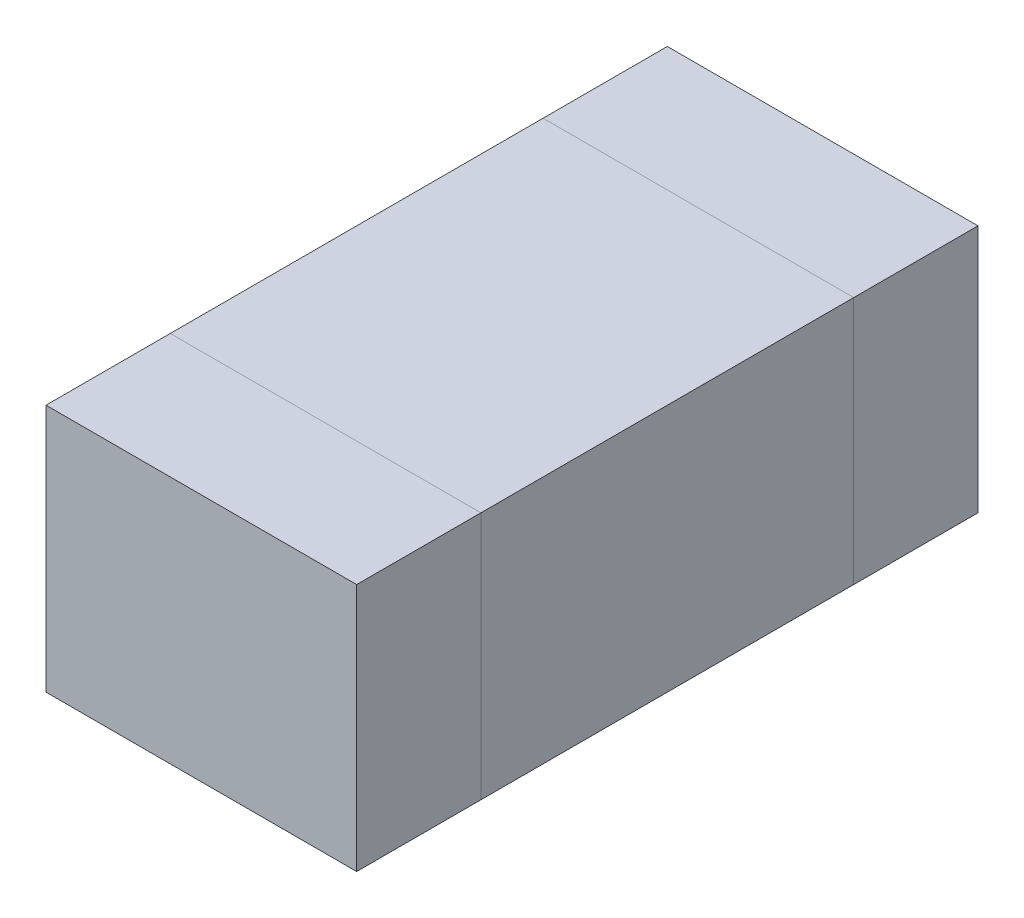
ISO-10303-21;
HEADER;
FILE_DESCRIPTION(('STEP AP214'),'2;1');
FILE_NAME('part.step','',(''),(''),'','','');
FILE_SCHEMA(('AUTOMOTIVE_DESIGN { 1 0 10303 214 1 1 1 1 }'));
ENDSEC;
DATA;
#1=APPLICATION_CONTEXT('core data for automotive mechanical design processes');
#2=APPLICATION_PROTOCOL_DEFINITION('international standard','automotive_design',2000,#1);
#3=PRODUCT_CONTEXT('',#1,'mechanical');
#4=PRODUCT('Part','Part','',(#3));
#5=PRODUCT_RELATED_PRODUCT_CATEGORY('part','',(#4));
#6=PRODUCT_DEFINITION_FORMATION('','',#4);
#7=PRODUCT_DEFINITION_CONTEXT('part definition',#1,'design');
#8=PRODUCT_DEFINITION('design','',#6,#7);
#9=PRODUCT_DEFINITION_SHAPE('','',#8);
#10=(LENGTH_UNIT() NAMED_UNIT(*) SI_UNIT(.MILLI.,.METRE.));
#11=(NAMED_UNIT(*) PLANE_ANGLE_UNIT() SI_UNIT($,.RADIAN.));
#12=(NAMED_UNIT(*) SI_UNIT($,.STERADIAN.) SOLID_ANGLE_UNIT());
#13=UNCERTAINTY_MEASURE_WITH_UNIT(LENGTH_MEASURE(1.E-05),#10,'distance_accuracy_value','');
#14=(GEOMETRIC_REPRESENTATION_CONTEXT(3) GLOBAL_UNCERTAINTY_ASSIGNED_CONTEXT((#13)) GLOBAL_UNIT_ASSIGNED_CONTEXT((#10,
#11,#12)) REPRESENTATION_CONTEXT('',''));
#15=CARTESIAN_POINT('',(0.,0.,0.));
#16=DIRECTION('',(0.,0.,1.));
#17=DIRECTION('',(1.,0.,0.));
#18=AXIS2_PLACEMENT_3D('',#15,#16,#17);
#19=CARTESIAN_POINT('',(0.,0.,0.));
#20=DIRECTION('',(0.,1.,0.));
#21=DIRECTION('',(1.,0.,0.));
#22=AXIS2_PLACEMENT_3D('',#19,#20,#21);
#23=PLANE('',#22);
#24=DIRECTION('',(0.,0.,-1.));
#25=VECTOR('',#24,1.);
#26=CARTESIAN_POINT('',(0.25,0.,-0.3));
#27=LINE('',#26,#25);
#28=CARTESIAN_POINT('',(0.25,0.,0.3));
#29=VERTEX_POINT('',#28);
#30=CARTESIAN_POINT('',(0.25,0.,-0.3));
#31=VERTEX_POINT('',#30);
#32=EDGE_CURVE('P0_E91',#29,#31,#27,.T.);
#33=ORIENTED_EDGE('',*,*,#32,.F.);
#34=DIRECTION('',(1.,0.,0.));
#35=VECTOR('',#34,1.);
#36=CARTESIAN_POINT('',(-0.25,0.,0.3));
#37=LINE('',#36,#35);
#38=CARTESIAN_POINT('',(-0.25,0.,0.3));
#39=VERTEX_POINT('',#38);
#40=EDGE_CURVE('P0_E25',#39,#29,#37,.T.);
#41=ORIENTED_EDGE('',*,*,#40,.F.);
#42=DIRECTION('',(0.,0.,1.));
#43=VECTOR('',#42,1.);
#44=CARTESIAN_POINT('',(-0.25,0.,-0.3));
#45=LINE('',#44,#43);
#46=CARTESIAN_POINT('',(-0.25,0.,-0.3));
#47=VERTEX_POINT('',#46);
#48=EDGE_CURVE('P0_E100',#47,#39,#45,.T.);
#49=ORIENTED_EDGE('',*,*,#48,.F.);
#50=DIRECTION('',(-1.,0.,0.));
#51=VECTOR('',#50,1.);
#52=CARTESIAN_POINT('',(-0.25,0.,-0.3));
#53=LINE('',#52,#51);
#54=EDGE_CURVE('P0_E80',#31,#47,#53,.T.);
#55=ORIENTED_EDGE('',*,*,#54,.F.);
#56=EDGE_LOOP('',(#33,#41,#49,#55));
#57=FACE_BOUND('',#56,.T.);
#58=ADVANCED_FACE('P0_F16',(#57),#23,.F.);
#59=CARTESIAN_POINT('',(0.,0.4,0.));
#60=DIRECTION('',(0.,1.,0.));
#61=DIRECTION('',(1.,0.,0.));
#62=AXIS2_PLACEMENT_3D('',#59,#60,#61);
#63=PLANE('',#62);
#64=DIRECTION('',(0.,0.,-1.));
#65=VECTOR('',#64,1.);
#66=CARTESIAN_POINT('',(0.25,0.4,-0.3));
#67=LINE('',#66,#65);
#68=CARTESIAN_POINT('',(0.25,0.4,0.3));
#69=VERTEX_POINT('',#68);
#70=CARTESIAN_POINT('',(0.25,0.4,-0.3));
#71=VERTEX_POINT('',#70);
#72=EDGE_CURVE('P0_E71',#69,#71,#67,.T.);
#73=ORIENTED_EDGE('',*,*,#72,.T.);
#74=DIRECTION('',(-1.,0.,0.));
#75=VECTOR('',#74,1.);
#76=CARTESIAN_POINT('',(-0.25,0.4,-0.3));
#77=LINE('',#76,#75);
#78=CARTESIAN_POINT('',(-0.25,0.4,-0.3));
#79=VERTEX_POINT('',#78);
#80=EDGE_CURVE('P0_E105',#71,#79,#77,.T.);
#81=ORIENTED_EDGE('',*,*,#80,.T.);
#82=DIRECTION('',(0.,0.,1.));
#83=VECTOR('',#82,1.);
#84=CARTESIAN_POINT('',(-0.25,0.4,-0.3));
#85=LINE('',#84,#83);
#86=CARTESIAN_POINT('',(-0.25,0.4,0.3));
#87=VERTEX_POINT('',#86);
#88=EDGE_CURVE('P0_E73',#79,#87,#85,.T.);
#89=ORIENTED_EDGE('',*,*,#88,.T.);
#90=DIRECTION('',(1.,0.,0.));
#91=VECTOR('',#90,1.);
#92=CARTESIAN_POINT('',(-0.25,0.4,0.3));
#93=LINE('',#92,#91);
#94=EDGE_CURVE('P0_E11',#87,#69,#93,.T.);
#95=ORIENTED_EDGE('',*,*,#94,.T.);
#96=EDGE_LOOP('',(#73,#81,#89,#95));
#97=FACE_BOUND('',#96,.T.);
#98=ADVANCED_FACE('P0_F68',(#97),#63,.T.);
#99=CARTESIAN_POINT('',(-0.25,0.4,0.3));
#100=DIRECTION('',(0.,0.,-1.));
#101=DIRECTION('',(0.,-1.,0.));
#102=AXIS2_PLACEMENT_3D('',#99,#100,#101);
#103=PLANE('',#102);
#104=ORIENTED_EDGE('',*,*,#40,.T.);
#105=DIRECTION('',(0.,-1.,0.));
#106=VECTOR('',#105,1.);
#107=CARTESIAN_POINT('',(0.25,0.4,0.3));
#108=LINE('',#107,#106);
#109=EDGE_CURVE('P0_E76',#69,#29,#108,.T.);
#110=ORIENTED_EDGE('',*,*,#109,.F.);
#111=ORIENTED_EDGE('',*,*,#94,.F.);
#112=DIRECTION('',(0.,-1.,0.));
#113=VECTOR('',#112,1.);
#114=CARTESIAN_POINT('',(-0.25,0.4,0.3));
#115=LINE('',#114,#113);
#116=EDGE_CURVE('P0_E104',#87,#39,#115,.T.);
#117=ORIENTED_EDGE('',*,*,#116,.T.);
#118=EDGE_LOOP('',(#104,#110,#111,#117));
#119=FACE_BOUND('',#118,.T.);
#120=ADVANCED_FACE('P0_F18',(#119),#103,.F.);
#121=CARTESIAN_POINT('',(-0.25,0.4,-0.3));
#122=DIRECTION('',(1.,0.,0.));
#123=DIRECTION('',(0.,0.,-1.));
#124=AXIS2_PLACEMENT_3D('',#121,#122,#123);
#125=PLANE('',#124);
#126=ORIENTED_EDGE('',*,*,#48,.T.);
#127=ORIENTED_EDGE('',*,*,#116,.F.);
#128=ORIENTED_EDGE('',*,*,#88,.F.);
#129=DIRECTION('',(0.,-1.,0.));
#130=VECTOR('',#129,1.);
#131=CARTESIAN_POINT('',(-0.25,0.4,-0.3));
#132=LINE('',#131,#130);
#133=EDGE_CURVE('P0_E97',#79,#47,#132,.T.);
#134=ORIENTED_EDGE('',*,*,#133,.T.);
#135=EDGE_LOOP('',(#126,#127,#128,#134));
#136=FACE_BOUND('',#135,.T.);
#137=ADVANCED_FACE('P0_F119',(#136),#125,.F.);
#138=CARTESIAN_POINT('',(-0.25,0.4,-0.3));
#139=DIRECTION('',(0.,0.,1.));
#140=DIRECTION('',(1.,0.,0.));
#141=AXIS2_PLACEMENT_3D('',#138,#139,#140);
#142=PLANE('',#141);
#143=ORIENTED_EDGE('',*,*,#54,.T.);
#144=ORIENTED_EDGE('',*,*,#133,.F.);
#145=ORIENTED_EDGE('',*,*,#80,.F.);
#146=DIRECTION('',(0.,-1.,0.));
#147=VECTOR('',#146,1.);
#148=CARTESIAN_POINT('',(0.25,0.4,-0.3));
#149=LINE('',#148,#147);
#150=EDGE_CURVE('P0_E84',#71,#31,#149,.T.);
#151=ORIENTED_EDGE('',*,*,#150,.T.);
#152=EDGE_LOOP('',(#143,#144,#145,#151));
#153=FACE_BOUND('',#152,.T.);
#154=ADVANCED_FACE('P0_F122',(#153),#142,.F.);
#155=CARTESIAN_POINT('',(0.25,0.4,-0.3));
#156=DIRECTION('',(-1.,0.,0.));
#157=DIRECTION('',(0.,1.,0.));
#158=AXIS2_PLACEMENT_3D('',#155,#156,#157);
#159=PLANE('',#158);
#160=ORIENTED_EDGE('',*,*,#32,.T.);
#161=ORIENTED_EDGE('',*,*,#150,.F.);
#162=ORIENTED_EDGE('',*,*,#72,.F.);
#163=ORIENTED_EDGE('',*,*,#109,.T.);
#164=EDGE_LOOP('',(#160,#161,#162,#163));
#165=FACE_BOUND('',#164,.T.);
#166=ADVANCED_FACE('P0_F82',(#165),#159,.F.);
#167=CLOSED_SHELL('',(#58,#98,#120,#137,#154,#166));
#168=MANIFOLD_SOLID_BREP('P0_B1',#167);
#169=CARTESIAN_POINT('',(-0.25,0.93851648071345,0.3));
#170=DIRECTION('',(-1.,0.,0.));
#171=DIRECTION('',(0.,0.,1.));
#172=AXIS2_PLACEMENT_3D('',#169,#170,#171);
#173=PLANE('',#172);
#174=DIRECTION('',(0.,-1.,0.));
#175=VECTOR('',#174,1.);
#176=CARTESIAN_POINT('',(-0.25,0.93851648071345,0.5));
#177=LINE('',#176,#175);
#178=CARTESIAN_POINT('',(-0.25,0.4,0.5));
#179=VERTEX_POINT('',#178);
#180=CARTESIAN_POINT('',(-0.25,0.,0.5));
#181=VERTEX_POINT('',#180);
#182=EDGE_CURVE('P1_E11',#179,#181,#177,.T.);
#183=ORIENTED_EDGE('',*,*,#182,.F.);
#184=DIRECTION('',(0.,0.,-1.));
#185=VECTOR('',#184,1.);
#186=CARTESIAN_POINT('',(-0.25,0.4,0.3));
#187=LINE('',#186,#185);
#188=CARTESIAN_POINT('',(-0.25,0.4,0.3));
#189=VERTEX_POINT('',#188);
#190=EDGE_CURVE('P1_E93',#179,#189,#187,.T.);
#191=ORIENTED_EDGE('',*,*,#190,.T.);
#192=DIRECTION('',(0.,-1.,0.));
#193=VECTOR('',#192,1.);
#194=CARTESIAN_POINT('',(-0.25,0.93851648071345,0.3));
#195=LINE('',#194,#193);
#196=CARTESIAN_POINT('',(-0.25,0.,0.3));
#197=VERTEX_POINT('',#196);
#198=EDGE_CURVE('P1_E76',#189,#197,#195,.T.);
#199=ORIENTED_EDGE('',*,*,#198,.T.);
#200=DIRECTION('',(0.,0.,-1.));
#201=VECTOR('',#200,1.);
#202=CARTESIAN_POINT('',(-0.25,0.,0.3));
#203=LINE('',#202,#201);
#204=EDGE_CURVE('P1_E96',#181,#197,#203,.T.);
#205=ORIENTED_EDGE('',*,*,#204,.F.);
#206=EDGE_LOOP('',(#183,#191,#199,#205));
#207=FACE_BOUND('',#206,.T.);
#208=ADVANCED_FACE('P1_F16',(#207),#173,.T.);
#209=CARTESIAN_POINT('',(-0.25,0.93851648071345,0.5));
#210=DIRECTION('',(0.,0.,1.));
#211=DIRECTION('',(1.,0.,0.));
#212=AXIS2_PLACEMENT_3D('',#209,#210,#211);
#213=PLANE('',#212);
#214=DIRECTION('',(0.,-1.,0.));
#215=VECTOR('',#214,1.);
#216=CARTESIAN_POINT('',(0.25,0.93851648071345,0.5));
#217=LINE('',#216,#215);
#218=CARTESIAN_POINT('',(0.25,0.4,0.5));
#219=VERTEX_POINT('',#218);
#220=CARTESIAN_POINT('',(0.25,0.,0.5));
#221=VERTEX_POINT('',#220);
#222=EDGE_CURVE('P1_E27',#219,#221,#217,.T.);
#223=ORIENTED_EDGE('',*,*,#222,.F.);
#224=DIRECTION('',(-1.,0.,0.));
#225=VECTOR('',#224,1.);
#226=CARTESIAN_POINT('',(-0.25,0.4,0.5));
#227=LINE('',#226,#225);
#228=EDGE_CURVE('P1_E20',#219,#179,#227,.T.);
#229=ORIENTED_EDGE('',*,*,#228,.T.);
#230=ORIENTED_EDGE('',*,*,#182,.T.);
#231=DIRECTION('',(-1.,0.,0.));
#232=VECTOR('',#231,1.);
#233=CARTESIAN_POINT('',(-0.25,0.,0.5));
#234=LINE('',#233,#232);
#235=EDGE_CURVE('P1_E87',#221,#181,#234,.T.);
#236=ORIENTED_EDGE('',*,*,#235,.F.);
#237=EDGE_LOOP('',(#223,#229,#230,#236));
#238=FACE_BOUND('',#237,.T.);
#239=ADVANCED_FACE('P1_F176',(#238),#213,.T.);
#240=CARTESIAN_POINT('',(0.25,0.93851648071345,0.3));
#241=DIRECTION('',(1.,0.,0.));
#242=DIRECTION('',(0.,1.,0.));
#243=AXIS2_PLACEMENT_3D('',#240,#241,#242);
#244=PLANE('',#243);
#245=DIRECTION('',(0.,-1.,0.));
#246=VECTOR('',#245,1.);
#247=CARTESIAN_POINT('',(0.25,0.93851648071345,0.3));
#248=LINE('',#247,#246);
#249=CARTESIAN_POINT('',(0.25,0.4,0.3));
#250=VERTEX_POINT('',#249);
#251=CARTESIAN_POINT('',(0.25,0.,0.3));
#252=VERTEX_POINT('',#251);
#253=EDGE_CURVE('P1_E60',#250,#252,#248,.T.);
#254=ORIENTED_EDGE('',*,*,#253,.F.);
#255=DIRECTION('',(0.,0.,1.));
#256=VECTOR('',#255,1.);
#257=CARTESIAN_POINT('',(0.25,0.4,0.3));
#258=LINE('',#257,#256);
#259=EDGE_CURVE('P1_E94',#250,#219,#258,.T.);
#260=ORIENTED_EDGE('',*,*,#259,.T.);
#261=ORIENTED_EDGE('',*,*,#222,.T.);
#262=DIRECTION('',(0.,0.,1.));
#263=VECTOR('',#262,1.);
#264=CARTESIAN_POINT('',(0.25,0.,0.3));
#265=LINE('',#264,#263);
#266=EDGE_CURVE('P1_E110',#252,#221,#265,.T.);
#267=ORIENTED_EDGE('',*,*,#266,.F.);
#268=EDGE_LOOP('',(#254,#260,#261,#267));
#269=FACE_BOUND('',#268,.T.);
#270=ADVANCED_FACE('P1_F206',(#269),#244,.T.);
#271=CARTESIAN_POINT('',(-0.25,0.93851648071345,0.3));
#272=DIRECTION('',(0.,0.,-1.));
#273=DIRECTION('',(0.,-1.,0.));
#274=AXIS2_PLACEMENT_3D('',#271,#272,#273);
#275=PLANE('',#274);
#276=ORIENTED_EDGE('',*,*,#198,.F.);
#277=DIRECTION('',(1.,0.,0.));
#278=VECTOR('',#277,1.);
#279=CARTESIAN_POINT('',(-0.25,0.4,0.3));
#280=LINE('',#279,#278);
#281=EDGE_CURVE('P1_E78',#189,#250,#280,.T.);
#282=ORIENTED_EDGE('',*,*,#281,.T.);
#283=ORIENTED_EDGE('',*,*,#253,.T.);
#284=DIRECTION('',(1.,0.,0.));
#285=VECTOR('',#284,1.);
#286=CARTESIAN_POINT('',(-0.25,0.,0.3));
#287=LINE('',#286,#285);
#288=EDGE_CURVE('P1_E81',#197,#252,#287,.T.);
#289=ORIENTED_EDGE('',*,*,#288,.F.);
#290=EDGE_LOOP('',(#276,#282,#283,#289));
#291=FACE_BOUND('',#290,.T.);
#292=ADVANCED_FACE('P1_F18',(#291),#275,.T.);
#293=CARTESIAN_POINT('',(0.,0.,0.));
#294=DIRECTION('',(0.,1.,0.));
#295=DIRECTION('',(1.,0.,0.));
#296=AXIS2_PLACEMENT_3D('',#293,#294,#295);
#297=PLANE('',#296);
#298=ORIENTED_EDGE('',*,*,#204,.T.);
#299=ORIENTED_EDGE('',*,*,#288,.T.);
#300=ORIENTED_EDGE('',*,*,#266,.T.);
#301=ORIENTED_EDGE('',*,*,#235,.T.);
#302=EDGE_LOOP('',(#298,#299,#300,#301));
#303=FACE_BOUND('',#302,.T.);
#304=ADVANCED_FACE('P1_F186',(#303),#297,.F.);
#305=CARTESIAN_POINT('',(0.,0.4,0.));
#306=DIRECTION('',(0.,1.,0.));
#307=DIRECTION('',(1.,0.,0.));
#308=AXIS2_PLACEMENT_3D('',#305,#306,#307);
#309=PLANE('',#308);
#310=ORIENTED_EDGE('',*,*,#190,.F.);
#311=ORIENTED_EDGE('',*,*,#228,.F.);
#312=ORIENTED_EDGE('',*,*,#259,.F.);
#313=ORIENTED_EDGE('',*,*,#281,.F.);
#314=EDGE_LOOP('',(#310,#311,#312,#313));
#315=FACE_BOUND('',#314,.T.);
#316=ADVANCED_FACE('P1_F91',(#315),#309,.T.);
#317=CLOSED_SHELL('',(#208,#239,#270,#292,#304,#316));
#318=MANIFOLD_SOLID_BREP('P1_B1',#317);
#319=CARTESIAN_POINT('',(-0.25,0.93851648071345,-0.3));
#320=DIRECTION('',(-1.,0.,0.));
#321=DIRECTION('',(0.,0.,1.));
#322=AXIS2_PLACEMENT_3D('',#319,#320,#321);
#323=PLANE('',#322);
#324=DIRECTION('',(0.,-1.,0.));
#325=VECTOR('',#324,1.);
#326=CARTESIAN_POINT('',(-0.25,0.93851648071345,-0.3));
#327=LINE('',#326,#325);
#328=CARTESIAN_POINT('',(-0.25,0.4,-0.3));
#329=VERTEX_POINT('',#328);
#330=CARTESIAN_POINT('',(-0.25,0.,-0.3));
#331=VERTEX_POINT('',#330);
#332=EDGE_CURVE('P2_E11',#329,#331,#327,.T.);
#333=ORIENTED_EDGE('',*,*,#332,.F.);
#334=DIRECTION('',(0.,0.,-1.));
#335=VECTOR('',#334,1.);
#336=CARTESIAN_POINT('',(-0.25,0.4,-0.3));
#337=LINE('',#336,#335);
#338=CARTESIAN_POINT('',(-0.25,0.4,-0.5));
#339=VERTEX_POINT('',#338);
#340=EDGE_CURVE('P2_E102',#329,#339,#337,.T.);
#341=ORIENTED_EDGE('',*,*,#340,.T.);
#342=DIRECTION('',(0.,-1.,0.));
#343=VECTOR('',#342,1.);
#344=CARTESIAN_POINT('',(-0.25,0.93851648071345,-0.5));
#345=LINE('',#344,#343);
#346=CARTESIAN_POINT('',(-0.25,0.,-0.5));
#347=VERTEX_POINT('',#346);
#348=EDGE_CURVE('P2_E20',#339,#347,#345,.T.);
#349=ORIENTED_EDGE('',*,*,#348,.T.);
#350=DIRECTION('',(0.,0.,-1.));
#351=VECTOR('',#350,1.);
#352=CARTESIAN_POINT('',(-0.25,0.,-0.3));
#353=LINE('',#352,#351);
#354=EDGE_CURVE('P2_E82',#331,#347,#353,.T.);
#355=ORIENTED_EDGE('',*,*,#354,.F.);
#356=EDGE_LOOP('',(#333,#341,#349,#355));
#357=FACE_BOUND('',#356,.T.);
#358=ADVANCED_FACE('P2_F16',(#357),#323,.T.);
#359=CARTESIAN_POINT('',(-0.25,0.93851648071345,-0.3));
#360=DIRECTION('',(0.,0.,1.));
#361=DIRECTION('',(1.,0.,0.));
#362=AXIS2_PLACEMENT_3D('',#359,#360,#361);
#363=PLANE('',#362);
#364=DIRECTION('',(0.,-1.,0.));
#365=VECTOR('',#364,1.);
#366=CARTESIAN_POINT('',(0.25,0.93851648071345,-0.3));
#367=LINE('',#366,#365);
#368=CARTESIAN_POINT('',(0.25,0.4,-0.3));
#369=VERTEX_POINT('',#368);
#370=CARTESIAN_POINT('',(0.25,0.,-0.3));
#371=VERTEX_POINT('',#370);
#372=EDGE_CURVE('P2_E26',#369,#371,#367,.T.);
#373=ORIENTED_EDGE('',*,*,#372,.F.);
#374=DIRECTION('',(-1.,0.,0.));
#375=VECTOR('',#374,1.);
#376=CARTESIAN_POINT('',(-0.25,0.4,-0.3));
#377=LINE('',#376,#375);
#378=EDGE_CURVE('P2_E73',#369,#329,#377,.T.);
#379=ORIENTED_EDGE('',*,*,#378,.T.);
#380=ORIENTED_EDGE('',*,*,#332,.T.);
#381=DIRECTION('',(-1.,0.,0.));
#382=VECTOR('',#381,1.);
#383=CARTESIAN_POINT('',(-0.25,0.,-0.3));
#384=LINE('',#383,#382);
#385=EDGE_CURVE('P2_E69',#371,#331,#384,.T.);
#386=ORIENTED_EDGE('',*,*,#385,.F.);
#387=EDGE_LOOP('',(#373,#379,#380,#386));
#388=FACE_BOUND('',#387,.T.);
#389=ADVANCED_FACE('P2_F68',(#388),#363,.T.);
#390=CARTESIAN_POINT('',(0.25,0.93851648071345,-0.3));
#391=DIRECTION('',(1.,0.,0.));
#392=DIRECTION('',(0.,0.,1.));
#393=AXIS2_PLACEMENT_3D('',#390,#391,#392);
#394=PLANE('',#393);
#395=DIRECTION('',(0.,-1.,0.));
#396=VECTOR('',#395,1.);
#397=CARTESIAN_POINT('',(0.25,0.93851648071345,-0.5));
#398=LINE('',#397,#396);
#399=CARTESIAN_POINT('',(0.25,0.4,-0.5));
#400=VERTEX_POINT('',#399);
#401=CARTESIAN_POINT('',(0.25,0.,-0.5));
#402=VERTEX_POINT('',#401);
#403=EDGE_CURVE('P2_E53',#400,#402,#398,.T.);
#404=ORIENTED_EDGE('',*,*,#403,.F.);
#405=DIRECTION('',(0.,0.,1.));
#406=VECTOR('',#405,1.);
#407=CARTESIAN_POINT('',(0.25,0.4,-0.3));
#408=LINE('',#407,#406);
#409=EDGE_CURVE('P2_E96',#400,#369,#408,.T.);
#410=ORIENTED_EDGE('',*,*,#409,.T.);
#411=ORIENTED_EDGE('',*,*,#372,.T.);
#412=DIRECTION('',(0.,0.,1.));
#413=VECTOR('',#412,1.);
#414=CARTESIAN_POINT('',(0.25,0.,-0.3));
#415=LINE('',#414,#413);
#416=EDGE_CURVE('P2_E83',#402,#371,#415,.T.);
#417=ORIENTED_EDGE('',*,*,#416,.F.);
#418=EDGE_LOOP('',(#404,#410,#411,#417));
#419=FACE_BOUND('',#418,.T.);
#420=ADVANCED_FACE('P2_F203',(#419),#394,.T.);
#421=CARTESIAN_POINT('',(-0.25,0.93851648071345,-0.5));
#422=DIRECTION('',(0.,0.,-1.));
#423=DIRECTION('',(0.,-1.,0.));
#424=AXIS2_PLACEMENT_3D('',#421,#422,#423);
#425=PLANE('',#424);
#426=ORIENTED_EDGE('',*,*,#348,.F.);
#427=DIRECTION('',(1.,0.,0.));
#428=VECTOR('',#427,1.);
#429=CARTESIAN_POINT('',(-0.25,0.4,-0.5));
#430=LINE('',#429,#428);
#431=EDGE_CURVE('P2_E88',#339,#400,#430,.T.);
#432=ORIENTED_EDGE('',*,*,#431,.T.);
#433=ORIENTED_EDGE('',*,*,#403,.T.);
#434=DIRECTION('',(1.,0.,0.));
#435=VECTOR('',#434,1.);
#436=CARTESIAN_POINT('',(-0.25,0.,-0.5));
#437=LINE('',#436,#435);
#438=EDGE_CURVE('P2_E87',#347,#402,#437,.T.);
#439=ORIENTED_EDGE('',*,*,#438,.F.);
#440=EDGE_LOOP('',(#426,#432,#433,#439));
#441=FACE_BOUND('',#440,.T.);
#442=ADVANCED_FACE('P2_F192',(#441),#425,.T.);
#443=CARTESIAN_POINT('',(0.,0.,0.));
#444=DIRECTION('',(0.,-1.,0.));
#445=DIRECTION('',(0.,0.,-1.));
#446=AXIS2_PLACEMENT_3D('',#443,#444,#445);
#447=PLANE('',#446);
#448=ORIENTED_EDGE('',*,*,#354,.T.);
#449=ORIENTED_EDGE('',*,*,#438,.T.);
#450=ORIENTED_EDGE('',*,*,#416,.T.);
#451=ORIENTED_EDGE('',*,*,#385,.T.);
#452=EDGE_LOOP('',(#448,#449,#450,#451));
#453=FACE_BOUND('',#452,.T.);
#454=ADVANCED_FACE('P2_F80',(#453),#447,.T.);
#455=CARTESIAN_POINT('',(0.,0.4,0.));
#456=DIRECTION('',(0.,1.,0.));
#457=DIRECTION('',(1.,0.,0.));
#458=AXIS2_PLACEMENT_3D('',#455,#456,#457);
#459=PLANE('',#458);
#460=ORIENTED_EDGE('',*,*,#340,.F.);
#461=ORIENTED_EDGE('',*,*,#378,.F.);
#462=ORIENTED_EDGE('',*,*,#409,.F.);
#463=ORIENTED_EDGE('',*,*,#431,.F.);
#464=EDGE_LOOP('',(#460,#461,#462,#463));
#465=FACE_BOUND('',#464,.T.);
#466=ADVANCED_FACE('P2_F18',(#465),#459,.T.);
#467=CLOSED_SHELL('',(#358,#389,#420,#442,#454,#466));
#468=MANIFOLD_SOLID_BREP('P2_B1',#467);
#469=ADVANCED_BREP_SHAPE_REPRESENTATION('',(#18,#168,#318,#468),#14);
#470=SHAPE_DEFINITION_REPRESENTATION(#9,#469);
ENDSEC;
END-ISO-10303-21;
